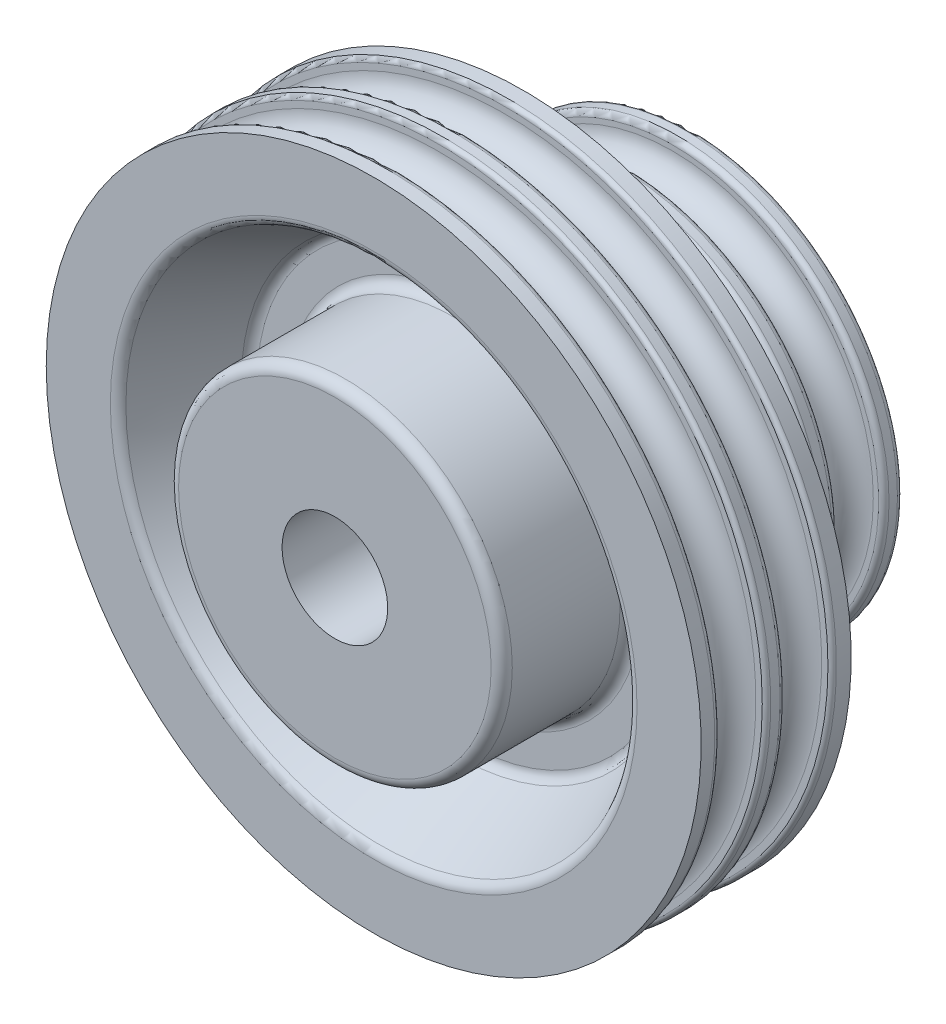
ISO-10303-21;
HEADER;
FILE_DESCRIPTION(('STEP AP214'),'2;1');
FILE_NAME('part.step','',(''),(''),'','','');
FILE_SCHEMA(('AUTOMOTIVE_DESIGN { 1 0 10303 214 1 1 1 1 }'));
ENDSEC;
DATA;
#1=APPLICATION_CONTEXT('core data for automotive mechanical design processes');
#2=APPLICATION_PROTOCOL_DEFINITION('international standard','automotive_design',2000,#1);
#3=PRODUCT_CONTEXT('',#1,'mechanical');
#4=PRODUCT('Part','Part','',(#3));
#5=PRODUCT_RELATED_PRODUCT_CATEGORY('part','',(#4));
#6=PRODUCT_DEFINITION_FORMATION('','',#4);
#7=PRODUCT_DEFINITION_CONTEXT('part definition',#1,'design');
#8=PRODUCT_DEFINITION('design','',#6,#7);
#9=PRODUCT_DEFINITION_SHAPE('','',#8);
#10=(LENGTH_UNIT() NAMED_UNIT(*) SI_UNIT(.MILLI.,.METRE.));
#11=(NAMED_UNIT(*) PLANE_ANGLE_UNIT() SI_UNIT($,.RADIAN.));
#12=(NAMED_UNIT(*) SI_UNIT($,.STERADIAN.) SOLID_ANGLE_UNIT());
#13=UNCERTAINTY_MEASURE_WITH_UNIT(LENGTH_MEASURE(1.E-05),#10,'distance_accuracy_value','');
#14=(GEOMETRIC_REPRESENTATION_CONTEXT(3) GLOBAL_UNCERTAINTY_ASSIGNED_CONTEXT((#13)) GLOBAL_UNIT_ASSIGNED_CONTEXT((#10,
#11,#12)) REPRESENTATION_CONTEXT('',''));
#15=CARTESIAN_POINT('',(0.,0.,0.));
#16=DIRECTION('',(0.,0.,1.));
#17=DIRECTION('',(1.,0.,0.));
#18=AXIS2_PLACEMENT_3D('',#15,#16,#17);
#19=CARTESIAN_POINT('',(-69.2512802675777,0.,1.65526286325597));
#20=DIRECTION('',(0.,0.,-1.));
#21=DIRECTION('',(-1.,0.,0.));
#22=AXIS2_PLACEMENT_3D('',#19,#20,#21);
#23=TOROIDAL_SURFACE('',#22,30.5000845419089,0.500000000000004);
#24=CARTESIAN_POINT('',(-69.2512802675777,0.,1.16534766525284));
#25=DIRECTION('',(0.,0.,-1.));
#26=DIRECTION('',(-1.,0.,0.));
#27=AXIS2_PLACEMENT_3D('',#24,#25,#26);
#28=CIRCLE('',#27,30.6);
#29=CARTESIAN_POINT('',(-99.8512802675777,0.,1.16534766525284));
#30=VERTEX_POINT('',#29);
#31=EDGE_CURVE('E10',#30,#30,#28,.T.);
#32=ORIENTED_EDGE('',*,*,#31,.F.);
#33=EDGE_LOOP('',(#32));
#34=FACE_BOUND('',#33,.T.);
#35=CARTESIAN_POINT('',(-69.2512802675777,0.,1.66445714199694));
#36=DIRECTION('',(0.,0.,-1.));
#37=DIRECTION('',(-1.,0.,0.));
#38=AXIS2_PLACEMENT_3D('',#35,#36,#37);
#39=CIRCLE('',#38,31.);
#40=CARTESIAN_POINT('',(-100.251280267578,0.,1.66445714199694));
#41=VERTEX_POINT('',#40);
#42=EDGE_CURVE('E151',#41,#41,#39,.T.);
#43=ORIENTED_EDGE('',*,*,#42,.T.);
#44=EDGE_LOOP('',(#43));
#45=FACE_BOUND('',#44,.T.);
#46=ADVANCED_FACE('F30',(#34,#45),#23,.T.);
#47=CARTESIAN_POINT('',(-39.2512802675777,0.,1.16534766525285));
#48=DIRECTION('',(0.,0.,1.));
#49=DIRECTION('',(1.,0.,0.));
#50=AXIS2_PLACEMENT_3D('',#47,#48,#49);
#51=PLANE('',#50);
#52=CARTESIAN_POINT('',(-69.2512802675777,0.,1.16534766525284));
#53=DIRECTION('',(0.,0.,-1.));
#54=DIRECTION('',(-1.,0.,0.));
#55=AXIS2_PLACEMENT_3D('',#52,#53,#54);
#56=CIRCLE('',#55,30.);
#57=CARTESIAN_POINT('',(-99.2512802675777,0.,1.16534766525284));
#58=VERTEX_POINT('',#57);
#59=EDGE_CURVE('E36',#58,#58,#56,.T.);
#60=ORIENTED_EDGE('',*,*,#59,.F.);
#61=EDGE_LOOP('',(#60));
#62=FACE_BOUND('',#61,.T.);
#63=ORIENTED_EDGE('',*,*,#31,.T.);
#64=EDGE_LOOP('',(#63));
#65=FACE_BOUND('',#64,.T.);
#66=ADVANCED_FACE('F339',(#62,#65),#51,.F.);
#67=CARTESIAN_POINT('',(-69.2512802675777,0.,-1.03465233474715));
#68=DIRECTION('',(0.,0.,-1.));
#69=DIRECTION('',(-1.,0.,0.));
#70=AXIS2_PLACEMENT_3D('',#67,#68,#69);
#71=TOROIDAL_SURFACE('',#70,30.,2.2);
#72=CARTESIAN_POINT('',(-69.2512802675777,0.,-3.23465233474715));
#73=DIRECTION('',(0.,0.,-1.));
#74=DIRECTION('',(-1.,0.,0.));
#75=AXIS2_PLACEMENT_3D('',#72,#73,#74);
#76=CIRCLE('',#75,30.);
#77=CARTESIAN_POINT('',(-99.2512802675777,0.,-3.23465233474716));
#78=VERTEX_POINT('',#77);
#79=EDGE_CURVE('E40',#78,#78,#76,.T.);
#80=ORIENTED_EDGE('',*,*,#79,.F.);
#81=EDGE_LOOP('',(#80));
#82=FACE_BOUND('',#81,.T.);
#83=ORIENTED_EDGE('',*,*,#59,.T.);
#84=EDGE_LOOP('',(#83));
#85=FACE_BOUND('',#84,.T.);
#86=ADVANCED_FACE('F334',(#82,#85),#71,.F.);
#87=CARTESIAN_POINT('',(-38.6512802675777,0.,-3.23465233474714));
#88=DIRECTION('',(0.,0.,-1.));
#89=DIRECTION('',(-1.,0.,0.));
#90=AXIS2_PLACEMENT_3D('',#87,#88,#89);
#91=PLANE('',#90);
#92=CARTESIAN_POINT('',(-69.2512802675777,0.,-3.23465233474715));
#93=DIRECTION('',(0.,0.,-1.));
#94=DIRECTION('',(-1.,0.,0.));
#95=AXIS2_PLACEMENT_3D('',#92,#93,#94);
#96=CIRCLE('',#95,30.6);
#97=CARTESIAN_POINT('',(-99.8512802675777,0.,-3.23465233474716));
#98=VERTEX_POINT('',#97);
#99=EDGE_CURVE('E44',#98,#98,#96,.T.);
#100=ORIENTED_EDGE('',*,*,#99,.F.);
#101=EDGE_LOOP('',(#100));
#102=FACE_BOUND('',#101,.T.);
#103=ORIENTED_EDGE('',*,*,#79,.T.);
#104=EDGE_LOOP('',(#103));
#105=FACE_BOUND('',#104,.T.);
#106=ADVANCED_FACE('F328',(#102,#105),#91,.F.);
#107=CARTESIAN_POINT('',(-69.2512802675777,0.,-3.63465233474713));
#108=DIRECTION('',(0.,0.,-1.));
#109=DIRECTION('',(-1.,0.,0.));
#110=AXIS2_PLACEMENT_3D('',#107,#108,#109);
#111=TOROIDAL_SURFACE('',#110,30.6,0.399999999999977);
#112=CARTESIAN_POINT('',(-69.2512802675777,0.,-3.63465233474713));
#113=DIRECTION('',(0.,0.,-1.));
#114=DIRECTION('',(-1.,0.,0.));
#115=AXIS2_PLACEMENT_3D('',#112,#113,#114);
#116=CIRCLE('',#115,31.);
#117=CARTESIAN_POINT('',(-100.251280267578,0.,-3.63465233474713));
#118=VERTEX_POINT('',#117);
#119=EDGE_CURVE('E49',#118,#118,#116,.T.);
#120=ORIENTED_EDGE('',*,*,#119,.F.);
#121=EDGE_LOOP('',(#120));
#122=FACE_BOUND('',#121,.T.);
#123=ORIENTED_EDGE('',*,*,#99,.T.);
#124=EDGE_LOOP('',(#123));
#125=FACE_BOUND('',#124,.T.);
#126=ADVANCED_FACE('F322',(#122,#125),#111,.T.);
#127=CARTESIAN_POINT('',(-69.2512802675777,0.,-55.2783424319312));
#128=DIRECTION('',(0.,0.,-1.));
#129=DIRECTION('',(-1.,0.,0.));
#130=AXIS2_PLACEMENT_3D('',#127,#128,#129);
#131=CYLINDRICAL_SURFACE('',#130,31.);
#132=CARTESIAN_POINT('',(-69.2512802675777,0.,-4.5161790880647));
#133=DIRECTION('',(0.,0.,-1.));
#134=DIRECTION('',(-1.,0.,0.));
#135=AXIS2_PLACEMENT_3D('',#132,#133,#134);
#136=CIRCLE('',#135,31.);
#137=CARTESIAN_POINT('',(-100.251280267578,0.,-4.5161790880647));
#138=VERTEX_POINT('',#137);
#139=EDGE_CURVE('E52',#138,#138,#136,.T.);
#140=ORIENTED_EDGE('',*,*,#139,.F.);
#141=EDGE_LOOP('',(#140));
#142=FACE_BOUND('',#141,.T.);
#143=ORIENTED_EDGE('',*,*,#119,.T.);
#144=EDGE_LOOP('',(#143));
#145=FACE_BOUND('',#144,.T.);
#146=ADVANCED_FACE('F316',(#142,#145),#131,.T.);
#147=CARTESIAN_POINT('',(-69.2512802675777,0.,-4.5161790880647));
#148=DIRECTION('',(0.,0.,-1.));
#149=DIRECTION('',(-1.,0.,0.));
#150=AXIS2_PLACEMENT_3D('',#147,#148,#149);
#151=TOROIDAL_SURFACE('',#150,30.5,0.5);
#152=CARTESIAN_POINT('',(-69.2512802675777,0.,-5.0161790880647));
#153=DIRECTION('',(0.,0.,-1.));
#154=DIRECTION('',(-1.,0.,0.));
#155=AXIS2_PLACEMENT_3D('',#152,#153,#154);
#156=CIRCLE('',#155,30.5);
#157=CARTESIAN_POINT('',(-99.7512802675777,0.,-5.0161790880647));
#158=VERTEX_POINT('',#157);
#159=EDGE_CURVE('E55',#158,#158,#156,.T.);
#160=ORIENTED_EDGE('',*,*,#159,.F.);
#161=EDGE_LOOP('',(#160));
#162=FACE_BOUND('',#161,.T.);
#163=ORIENTED_EDGE('',*,*,#139,.T.);
#164=EDGE_LOOP('',(#163));
#165=FACE_BOUND('',#164,.T.);
#166=ADVANCED_FACE('F310',(#162,#165),#151,.T.);
#167=CARTESIAN_POINT('',(-39.2512802675777,0.,-5.01617908806469));
#168=DIRECTION('',(0.,0.,1.));
#169=DIRECTION('',(1.,0.,0.));
#170=AXIS2_PLACEMENT_3D('',#167,#168,#169);
#171=PLANE('',#170);
#172=CARTESIAN_POINT('',(-69.2512802675777,0.,-5.0161790880647));
#173=DIRECTION('',(0.,0.,-1.));
#174=DIRECTION('',(-1.,0.,0.));
#175=AXIS2_PLACEMENT_3D('',#172,#173,#174);
#176=CIRCLE('',#175,30.);
#177=CARTESIAN_POINT('',(-99.2512802675777,0.,-5.0161790880647));
#178=VERTEX_POINT('',#177);
#179=EDGE_CURVE('E58',#178,#178,#176,.T.);
#180=ORIENTED_EDGE('',*,*,#179,.F.);
#181=EDGE_LOOP('',(#180));
#182=FACE_BOUND('',#181,.T.);
#183=ORIENTED_EDGE('',*,*,#159,.T.);
#184=EDGE_LOOP('',(#183));
#185=FACE_BOUND('',#184,.T.);
#186=ADVANCED_FACE('F304',(#182,#185),#171,.F.);
#187=CARTESIAN_POINT('',(-69.2512802675777,0.,-7.23465233474715));
#188=DIRECTION('',(0.,0.,-1.));
#189=DIRECTION('',(-1.,0.,0.));
#190=AXIS2_PLACEMENT_3D('',#187,#188,#189);
#191=TOROIDAL_SURFACE('',#190,30.,2.21847324668245);
#192=CARTESIAN_POINT('',(-69.2512802675777,0.,-9.4531255814296));
#193=DIRECTION('',(0.,0.,-1.));
#194=DIRECTION('',(-1.,0.,0.));
#195=AXIS2_PLACEMENT_3D('',#192,#193,#194);
#196=CIRCLE('',#195,30.);
#197=CARTESIAN_POINT('',(-99.2512802675777,0.,-9.45312558142961));
#198=VERTEX_POINT('',#197);
#199=EDGE_CURVE('E61',#198,#198,#196,.T.);
#200=ORIENTED_EDGE('',*,*,#199,.F.);
#201=EDGE_LOOP('',(#200));
#202=FACE_BOUND('',#201,.T.);
#203=ORIENTED_EDGE('',*,*,#179,.T.);
#204=EDGE_LOOP('',(#203));
#205=FACE_BOUND('',#204,.T.);
#206=ADVANCED_FACE('F298',(#202,#205),#191,.F.);
#207=CARTESIAN_POINT('',(-38.6512802675777,0.,-9.4531255814296));
#208=DIRECTION('',(0.,0.,-1.));
#209=DIRECTION('',(-1.,0.,0.));
#210=AXIS2_PLACEMENT_3D('',#207,#208,#209);
#211=PLANE('',#210);
#212=CARTESIAN_POINT('',(-69.2512802675777,0.,-9.4531255814296));
#213=DIRECTION('',(0.,0.,-1.));
#214=DIRECTION('',(-1.,0.,0.));
#215=AXIS2_PLACEMENT_3D('',#212,#213,#214);
#216=CIRCLE('',#215,30.6);
#217=CARTESIAN_POINT('',(-99.8512802675777,0.,-9.45312558142961));
#218=VERTEX_POINT('',#217);
#219=EDGE_CURVE('E64',#218,#218,#216,.T.);
#220=ORIENTED_EDGE('',*,*,#219,.F.);
#221=EDGE_LOOP('',(#220));
#222=FACE_BOUND('',#221,.T.);
#223=ORIENTED_EDGE('',*,*,#199,.T.);
#224=EDGE_LOOP('',(#223));
#225=FACE_BOUND('',#224,.T.);
#226=ADVANCED_FACE('F292',(#222,#225),#211,.F.);
#227=CARTESIAN_POINT('',(-69.2512802675777,0.,-9.85312558142958));
#228=DIRECTION('',(0.,0.,-1.));
#229=DIRECTION('',(-1.,0.,0.));
#230=AXIS2_PLACEMENT_3D('',#227,#228,#229);
#231=TOROIDAL_SURFACE('',#230,30.6,0.399999999999977);
#232=CARTESIAN_POINT('',(-69.2512802675777,0.,-9.85312558142958));
#233=DIRECTION('',(0.,0.,-1.));
#234=DIRECTION('',(-1.,0.,0.));
#235=AXIS2_PLACEMENT_3D('',#232,#233,#234);
#236=CIRCLE('',#235,31.);
#237=CARTESIAN_POINT('',(-100.251280267578,0.,-9.85312558142959));
#238=VERTEX_POINT('',#237);
#239=EDGE_CURVE('E67',#238,#238,#236,.T.);
#240=ORIENTED_EDGE('',*,*,#239,.F.);
#241=EDGE_LOOP('',(#240));
#242=FACE_BOUND('',#241,.T.);
#243=ORIENTED_EDGE('',*,*,#219,.T.);
#244=EDGE_LOOP('',(#243));
#245=FACE_BOUND('',#244,.T.);
#246=ADVANCED_FACE('F286',(#242,#245),#231,.T.);
#247=CARTESIAN_POINT('',(-69.2512802675777,0.,-55.2783424319312));
#248=DIRECTION('',(0.,0.,-1.));
#249=DIRECTION('',(-1.,0.,0.));
#250=AXIS2_PLACEMENT_3D('',#247,#248,#249);
#251=CYLINDRICAL_SURFACE('',#250,31.);
#252=CARTESIAN_POINT('',(-69.2512802675777,0.,-11.2531255814296));
#253=DIRECTION('',(0.,0.,-1.));
#254=DIRECTION('',(-1.,0.,0.));
#255=AXIS2_PLACEMENT_3D('',#252,#253,#254);
#256=CIRCLE('',#255,31.);
#257=CARTESIAN_POINT('',(-100.251280267578,0.,-11.2531255814296));
#258=VERTEX_POINT('',#257);
#259=EDGE_CURVE('E70',#258,#258,#256,.T.);
#260=ORIENTED_EDGE('',*,*,#259,.F.);
#261=EDGE_LOOP('',(#260));
#262=FACE_BOUND('',#261,.T.);
#263=ORIENTED_EDGE('',*,*,#239,.T.);
#264=EDGE_LOOP('',(#263));
#265=FACE_BOUND('',#264,.T.);
#266=ADVANCED_FACE('F280',(#262,#265),#251,.T.);
#267=CARTESIAN_POINT('',(-48.7512802675777,0.,-11.2531255814296));
#268=DIRECTION('',(0.,0.,1.));
#269=DIRECTION('',(1.,0.,0.));
#270=AXIS2_PLACEMENT_3D('',#267,#268,#269);
#271=PLANE('',#270);
#272=CARTESIAN_POINT('',(-69.2512802675777,0.,-11.2531255814296));
#273=DIRECTION('',(0.,0.,-1.));
#274=DIRECTION('',(-1.,0.,0.));
#275=AXIS2_PLACEMENT_3D('',#272,#273,#274);
#276=CIRCLE('',#275,20.5);
#277=CARTESIAN_POINT('',(-89.7512802675777,0.,-11.2531255814296));
#278=VERTEX_POINT('',#277);
#279=EDGE_CURVE('E73',#278,#278,#276,.T.);
#280=ORIENTED_EDGE('',*,*,#279,.F.);
#281=EDGE_LOOP('',(#280));
#282=FACE_BOUND('',#281,.T.);
#283=ORIENTED_EDGE('',*,*,#259,.T.);
#284=EDGE_LOOP('',(#283));
#285=FACE_BOUND('',#284,.T.);
#286=ADVANCED_FACE('F274',(#282,#285),#271,.F.);
#287=CARTESIAN_POINT('',(-69.2512802675777,0.,-11.7531255814296));
#288=DIRECTION('',(0.,0.,-1.));
#289=DIRECTION('',(-1.,0.,0.));
#290=AXIS2_PLACEMENT_3D('',#287,#288,#289);
#291=TOROIDAL_SURFACE('',#290,20.5,0.5);
#292=CARTESIAN_POINT('',(-69.2512802675777,0.,-11.7531255814296));
#293=DIRECTION('',(0.,0.,-1.));
#294=DIRECTION('',(-1.,0.,0.));
#295=AXIS2_PLACEMENT_3D('',#292,#293,#294);
#296=CIRCLE('',#295,20.);
#297=CARTESIAN_POINT('',(-89.2512802675777,0.,-11.7531255814296));
#298=VERTEX_POINT('',#297);
#299=EDGE_CURVE('E76',#298,#298,#296,.T.);
#300=ORIENTED_EDGE('',*,*,#299,.F.);
#301=EDGE_LOOP('',(#300));
#302=FACE_BOUND('',#301,.T.);
#303=ORIENTED_EDGE('',*,*,#279,.T.);
#304=EDGE_LOOP('',(#303));
#305=FACE_BOUND('',#304,.T.);
#306=ADVANCED_FACE('F268',(#302,#305),#291,.F.);
#307=CARTESIAN_POINT('',(-69.2512802675777,0.,-55.2783424319312));
#308=DIRECTION('',(0.,0.,-1.));
#309=DIRECTION('',(-1.,0.,0.));
#310=AXIS2_PLACEMENT_3D('',#307,#308,#309);
#311=CYLINDRICAL_SURFACE('',#310,20.);
#312=CARTESIAN_POINT('',(-69.2512802675777,0.,-14.2531255814296));
#313=DIRECTION('',(0.,0.,-1.));
#314=DIRECTION('',(-1.,0.,0.));
#315=AXIS2_PLACEMENT_3D('',#312,#313,#314);
#316=CIRCLE('',#315,20.);
#317=CARTESIAN_POINT('',(-89.2512802675777,0.,-14.2531255814296));
#318=VERTEX_POINT('',#317);
#319=EDGE_CURVE('E79',#318,#318,#316,.T.);
#320=ORIENTED_EDGE('',*,*,#319,.F.);
#321=EDGE_LOOP('',(#320));
#322=FACE_BOUND('',#321,.T.);
#323=ORIENTED_EDGE('',*,*,#299,.T.);
#324=EDGE_LOOP('',(#323));
#325=FACE_BOUND('',#324,.T.);
#326=ADVANCED_FACE('F262',(#322,#325),#311,.T.);
#327=CARTESIAN_POINT('',(-69.2512802675777,0.,-14.2531255814296));
#328=DIRECTION('',(0.,0.,-1.));
#329=DIRECTION('',(-1.,0.,0.));
#330=AXIS2_PLACEMENT_3D('',#327,#328,#329);
#331=TOROIDAL_SURFACE('',#330,19.5,0.5);
#332=CARTESIAN_POINT('',(-69.2512802675777,0.,-14.7531255814296));
#333=DIRECTION('',(0.,0.,-1.));
#334=DIRECTION('',(-1.,0.,0.));
#335=AXIS2_PLACEMENT_3D('',#332,#333,#334);
#336=CIRCLE('',#335,19.5);
#337=CARTESIAN_POINT('',(-88.7512802675777,0.,-14.7531255814296));
#338=VERTEX_POINT('',#337);
#339=EDGE_CURVE('E82',#338,#338,#336,.T.);
#340=ORIENTED_EDGE('',*,*,#339,.F.);
#341=EDGE_LOOP('',(#340));
#342=FACE_BOUND('',#341,.T.);
#343=ORIENTED_EDGE('',*,*,#319,.T.);
#344=EDGE_LOOP('',(#343));
#345=FACE_BOUND('',#344,.T.);
#346=ADVANCED_FACE('F256',(#342,#345),#331,.T.);
#347=CARTESIAN_POINT('',(-50.5903012459588,0.,-14.7531255814296));
#348=DIRECTION('',(0.,0.,1.));
#349=DIRECTION('',(1.,0.,0.));
#350=AXIS2_PLACEMENT_3D('',#347,#348,#349);
#351=PLANE('',#350);
#352=CARTESIAN_POINT('',(-69.2512802675777,0.,-14.7531255814296));
#353=DIRECTION('',(0.,0.,-1.));
#354=DIRECTION('',(-1.,0.,0.));
#355=AXIS2_PLACEMENT_3D('',#352,#353,#354);
#356=CIRCLE('',#355,18.660979021619);
#357=CARTESIAN_POINT('',(-87.9122592891967,0.,-14.7531255814296));
#358=VERTEX_POINT('',#357);
#359=EDGE_CURVE('E85',#358,#358,#356,.T.);
#360=ORIENTED_EDGE('',*,*,#359,.F.);
#361=EDGE_LOOP('',(#360));
#362=FACE_BOUND('',#361,.T.);
#363=ORIENTED_EDGE('',*,*,#339,.T.);
#364=EDGE_LOOP('',(#363));
#365=FACE_BOUND('',#364,.T.);
#366=ADVANCED_FACE('F250',(#362,#365),#351,.F.);
#367=CARTESIAN_POINT('',(-69.2512802675777,0.,-16.9494206839804));
#368=DIRECTION('',(0.,0.,-1.));
#369=DIRECTION('',(-1.,0.,0.));
#370=AXIS2_PLACEMENT_3D('',#367,#368,#369);
#371=TOROIDAL_SURFACE('',#370,18.788602775331,2.2);
#372=CARTESIAN_POINT('',(-69.2512802675777,0.,-19.1457157865311));
#373=DIRECTION('',(0.,0.,-1.));
#374=DIRECTION('',(-1.,0.,0.));
#375=AXIS2_PLACEMENT_3D('',#372,#373,#374);
#376=CIRCLE('',#375,18.9162265290429);
#377=CARTESIAN_POINT('',(-88.1675067966207,0.,-19.1457157865311));
#378=VERTEX_POINT('',#377);
#379=EDGE_CURVE('E88',#378,#378,#376,.T.);
#380=ORIENTED_EDGE('',*,*,#379,.F.);
#381=EDGE_LOOP('',(#380));
#382=FACE_BOUND('',#381,.T.);
#383=ORIENTED_EDGE('',*,*,#359,.T.);
#384=EDGE_LOOP('',(#383));
#385=FACE_BOUND('',#384,.T.);
#386=ADVANCED_FACE('F244',(#382,#385),#371,.F.);
#387=CARTESIAN_POINT('',(-50.3350537385348,0.,-19.1457157865311));
#388=DIRECTION('',(0.,0.,-1.));
#389=DIRECTION('',(-1.,0.,0.));
#390=AXIS2_PLACEMENT_3D('',#387,#388,#389);
#391=PLANE('',#390);
#392=CARTESIAN_POINT('',(-69.2512802675777,0.,-19.1457157865311));
#393=DIRECTION('',(0.,0.,-1.));
#394=DIRECTION('',(-1.,0.,0.));
#395=AXIS2_PLACEMENT_3D('',#392,#393,#394);
#396=CIRCLE('',#395,19.5);
#397=CARTESIAN_POINT('',(-88.7512802675777,0.,-19.1457157865311));
#398=VERTEX_POINT('',#397);
#399=EDGE_CURVE('E91',#398,#398,#396,.T.);
#400=ORIENTED_EDGE('',*,*,#399,.F.);
#401=EDGE_LOOP('',(#400));
#402=FACE_BOUND('',#401,.T.);
#403=ORIENTED_EDGE('',*,*,#379,.T.);
#404=EDGE_LOOP('',(#403));
#405=FACE_BOUND('',#404,.T.);
#406=ADVANCED_FACE('F238',(#402,#405),#391,.F.);
#407=CARTESIAN_POINT('',(-69.2512802675777,0.,-19.6457157865311));
#408=DIRECTION('',(0.,0.,-1.));
#409=DIRECTION('',(-1.,0.,0.));
#410=AXIS2_PLACEMENT_3D('',#407,#408,#409);
#411=TOROIDAL_SURFACE('',#410,19.5,0.499999999999999);
#412=CARTESIAN_POINT('',(-69.2512802675777,0.,-19.6457157865311));
#413=DIRECTION('',(0.,0.,-1.));
#414=DIRECTION('',(-1.,0.,0.));
#415=AXIS2_PLACEMENT_3D('',#412,#413,#414);
#416=CIRCLE('',#415,20.);
#417=CARTESIAN_POINT('',(-89.2512802675777,0.,-19.6457157865311));
#418=VERTEX_POINT('',#417);
#419=EDGE_CURVE('E94',#418,#418,#416,.T.);
#420=ORIENTED_EDGE('',*,*,#419,.F.);
#421=EDGE_LOOP('',(#420));
#422=FACE_BOUND('',#421,.T.);
#423=ORIENTED_EDGE('',*,*,#399,.T.);
#424=EDGE_LOOP('',(#423));
#425=FACE_BOUND('',#424,.T.);
#426=ADVANCED_FACE('F232',(#422,#425),#411,.T.);
#427=CARTESIAN_POINT('',(-69.2512802675777,0.,-55.2783424319312));
#428=DIRECTION('',(0.,0.,-1.));
#429=DIRECTION('',(-1.,0.,0.));
#430=AXIS2_PLACEMENT_3D('',#427,#428,#429);
#431=CYLINDRICAL_SURFACE('',#430,20.);
#432=CARTESIAN_POINT('',(-69.2512802675777,0.,-20.4437652868408));
#433=DIRECTION('',(0.,0.,-1.));
#434=DIRECTION('',(-1.,0.,0.));
#435=AXIS2_PLACEMENT_3D('',#432,#433,#434);
#436=CIRCLE('',#435,20.);
#437=CARTESIAN_POINT('',(-89.2512802675777,0.,-20.4437652868408));
#438=VERTEX_POINT('',#437);
#439=EDGE_CURVE('E97',#438,#438,#436,.T.);
#440=ORIENTED_EDGE('',*,*,#439,.F.);
#441=EDGE_LOOP('',(#440));
#442=FACE_BOUND('',#441,.T.);
#443=ORIENTED_EDGE('',*,*,#419,.T.);
#444=EDGE_LOOP('',(#443));
#445=FACE_BOUND('',#444,.T.);
#446=ADVANCED_FACE('F226',(#442,#445),#431,.T.);
#447=CARTESIAN_POINT('',(-69.2512802675777,0.,-20.4437652868408));
#448=DIRECTION('',(0.,0.,-1.));
#449=DIRECTION('',(-1.,0.,0.));
#450=AXIS2_PLACEMENT_3D('',#447,#448,#449);
#451=TOROIDAL_SURFACE('',#450,19.5,0.500000000000004);
#452=CARTESIAN_POINT('',(-69.2512802675777,0.,-20.9437652868408));
#453=DIRECTION('',(0.,0.,-1.));
#454=DIRECTION('',(-1.,0.,0.));
#455=AXIS2_PLACEMENT_3D('',#452,#453,#454);
#456=CIRCLE('',#455,19.5);
#457=CARTESIAN_POINT('',(-88.7512802675777,0.,-20.9437652868408));
#458=VERTEX_POINT('',#457);
#459=EDGE_CURVE('E100',#458,#458,#456,.T.);
#460=ORIENTED_EDGE('',*,*,#459,.F.);
#461=EDGE_LOOP('',(#460));
#462=FACE_BOUND('',#461,.T.);
#463=ORIENTED_EDGE('',*,*,#439,.T.);
#464=EDGE_LOOP('',(#463));
#465=FACE_BOUND('',#464,.T.);
#466=ADVANCED_FACE('F220',(#462,#465),#451,.T.);
#467=CARTESIAN_POINT('',(-50.2512802675777,0.,-20.9437652868408));
#468=DIRECTION('',(0.,0.,1.));
#469=DIRECTION('',(1.,0.,0.));
#470=AXIS2_PLACEMENT_3D('',#467,#468,#469);
#471=PLANE('',#470);
#472=CARTESIAN_POINT('',(-69.2512802675777,0.,-20.9437652868408));
#473=DIRECTION('',(0.,0.,-1.));
#474=DIRECTION('',(-1.,0.,0.));
#475=AXIS2_PLACEMENT_3D('',#472,#473,#474);
#476=CIRCLE('',#475,19.);
#477=CARTESIAN_POINT('',(-88.2512802675777,0.,-20.9437652868408));
#478=VERTEX_POINT('',#477);
#479=EDGE_CURVE('E103',#478,#478,#476,.T.);
#480=ORIENTED_EDGE('',*,*,#479,.F.);
#481=EDGE_LOOP('',(#480));
#482=FACE_BOUND('',#481,.T.);
#483=ORIENTED_EDGE('',*,*,#459,.T.);
#484=EDGE_LOOP('',(#483));
#485=FACE_BOUND('',#484,.T.);
#486=ADVANCED_FACE('F214',(#482,#485),#471,.F.);
#487=CARTESIAN_POINT('',(-69.2512802675777,0.,-23.1437652868408));
#488=DIRECTION('',(0.,0.,-1.));
#489=DIRECTION('',(-1.,0.,0.));
#490=AXIS2_PLACEMENT_3D('',#487,#488,#489);
#491=TOROIDAL_SURFACE('',#490,19.,2.2);
#492=CARTESIAN_POINT('',(-69.2512802675777,0.,-25.3437652868408));
#493=DIRECTION('',(0.,0.,-1.));
#494=DIRECTION('',(-1.,0.,0.));
#495=AXIS2_PLACEMENT_3D('',#492,#493,#494);
#496=CIRCLE('',#495,19.);
#497=CARTESIAN_POINT('',(-88.2512802675777,0.,-25.3437652868408));
#498=VERTEX_POINT('',#497);
#499=EDGE_CURVE('E106',#498,#498,#496,.T.);
#500=ORIENTED_EDGE('',*,*,#499,.F.);
#501=EDGE_LOOP('',(#500));
#502=FACE_BOUND('',#501,.T.);
#503=ORIENTED_EDGE('',*,*,#479,.T.);
#504=EDGE_LOOP('',(#503));
#505=FACE_BOUND('',#504,.T.);
#506=ADVANCED_FACE('F208',(#502,#505),#491,.F.);
#507=CARTESIAN_POINT('',(-49.7512166417142,0.,-25.3437652868408));
#508=DIRECTION('',(0.,0.,-1.));
#509=DIRECTION('',(-1.,0.,0.));
#510=AXIS2_PLACEMENT_3D('',#507,#508,#509);
#511=PLANE('',#510);
#512=CARTESIAN_POINT('',(-69.2512802675777,0.,-25.3437652868408));
#513=DIRECTION('',(0.,0.,-1.));
#514=DIRECTION('',(-1.,0.,0.));
#515=AXIS2_PLACEMENT_3D('',#512,#513,#514);
#516=CIRCLE('',#515,19.5000636258635);
#517=CARTESIAN_POINT('',(-88.7513438934412,0.,-25.3437652868408));
#518=VERTEX_POINT('',#517);
#519=EDGE_CURVE('E109',#518,#518,#516,.T.);
#520=ORIENTED_EDGE('',*,*,#519,.F.);
#521=EDGE_LOOP('',(#520));
#522=FACE_BOUND('',#521,.T.);
#523=ORIENTED_EDGE('',*,*,#499,.T.);
#524=EDGE_LOOP('',(#523));
#525=FACE_BOUND('',#524,.T.);
#526=ADVANCED_FACE('F202',(#522,#525),#511,.F.);
#527=CARTESIAN_POINT('',(-69.2512802675777,0.,-25.8437652868408));
#528=DIRECTION('',(0.,0.,-1.));
#529=DIRECTION('',(-1.,0.,0.));
#530=AXIS2_PLACEMENT_3D('',#527,#528,#529);
#531=TOROIDAL_SURFACE('',#530,19.5000636258635,0.499999999999999);
#532=CARTESIAN_POINT('',(-69.2512802675777,0.,-25.835788958408));
#533=DIRECTION('',(0.,0.,-1.));
#534=DIRECTION('',(-1.,0.,0.));
#535=AXIS2_PLACEMENT_3D('',#532,#533,#534);
#536=CIRCLE('',#535,20.);
#537=CARTESIAN_POINT('',(-89.2512802675777,0.,-25.835788958408));
#538=VERTEX_POINT('',#537);
#539=EDGE_CURVE('E112',#538,#538,#536,.T.);
#540=ORIENTED_EDGE('',*,*,#539,.F.);
#541=EDGE_LOOP('',(#540));
#542=FACE_BOUND('',#541,.T.);
#543=ORIENTED_EDGE('',*,*,#519,.T.);
#544=EDGE_LOOP('',(#543));
#545=FACE_BOUND('',#544,.T.);
#546=ADVANCED_FACE('F196',(#542,#545),#531,.T.);
#547=CARTESIAN_POINT('',(-69.2512802675777,0.,-55.2783424319312));
#548=DIRECTION('',(0.,0.,-1.));
#549=DIRECTION('',(-1.,0.,0.));
#550=AXIS2_PLACEMENT_3D('',#547,#548,#549);
#551=CYLINDRICAL_SURFACE('',#550,20.);
#552=CARTESIAN_POINT('',(-69.2512802675777,0.,-26.635542858003));
#553=DIRECTION('',(0.,0.,-1.));
#554=DIRECTION('',(-1.,0.,0.));
#555=AXIS2_PLACEMENT_3D('',#552,#553,#554);
#556=CIRCLE('',#555,20.);
#557=CARTESIAN_POINT('',(-89.2512802675777,0.,-26.6355428580031));
#558=VERTEX_POINT('',#557);
#559=EDGE_CURVE('E115',#558,#558,#556,.T.);
#560=ORIENTED_EDGE('',*,*,#559,.F.);
#561=EDGE_LOOP('',(#560));
#562=FACE_BOUND('',#561,.T.);
#563=ORIENTED_EDGE('',*,*,#539,.T.);
#564=EDGE_LOOP('',(#563));
#565=FACE_BOUND('',#564,.T.);
#566=ADVANCED_FACE('F190',(#562,#565),#551,.T.);
#567=CARTESIAN_POINT('',(-69.2512802675777,0.,-26.6437652870685));
#568=DIRECTION('',(0.,0.,-1.));
#569=DIRECTION('',(-1.,0.,0.));
#570=AXIS2_PLACEMENT_3D('',#567,#568,#569);
#571=TOROIDAL_SURFACE('',#570,19.5000676129112,0.5);
#572=CARTESIAN_POINT('',(-69.2512802675777,0.,-27.1437652868408));
#573=DIRECTION('',(0.,0.,-1.));
#574=DIRECTION('',(-1.,0.,0.));
#575=AXIS2_PLACEMENT_3D('',#572,#573,#574);
#576=CIRCLE('',#575,19.500082702283);
#577=CARTESIAN_POINT('',(-88.7513629698607,0.,-27.1437652868408));
#578=VERTEX_POINT('',#577);
#579=EDGE_CURVE('E118',#578,#578,#576,.T.);
#580=ORIENTED_EDGE('',*,*,#579,.F.);
#581=EDGE_LOOP('',(#580));
#582=FACE_BOUND('',#581,.T.);
#583=ORIENTED_EDGE('',*,*,#559,.T.);
#584=EDGE_LOOP('',(#583));
#585=FACE_BOUND('',#584,.T.);
#586=ADVANCED_FACE('F184',(#582,#585),#571,.T.);
#587=CARTESIAN_POINT('',(-49.7511975652947,0.,-27.1437652868408));
#588=DIRECTION('',(0.,0.,1.));
#589=DIRECTION('',(1.,0.,0.));
#590=AXIS2_PLACEMENT_3D('',#587,#588,#589);
#591=PLANE('',#590);
#592=CARTESIAN_POINT('',(-69.2512802675777,0.,-27.1437652868408));
#593=DIRECTION('',(0.,0.,-1.));
#594=DIRECTION('',(-1.,0.,0.));
#595=AXIS2_PLACEMENT_3D('',#592,#593,#594);
#596=CIRCLE('',#595,11.);
#597=CARTESIAN_POINT('',(-80.2512802675777,0.,-27.1437652868408));
#598=VERTEX_POINT('',#597);
#599=EDGE_CURVE('E121',#598,#598,#596,.T.);
#600=ORIENTED_EDGE('',*,*,#599,.F.);
#601=EDGE_LOOP('',(#600));
#602=FACE_BOUND('',#601,.T.);
#603=ORIENTED_EDGE('',*,*,#579,.T.);
#604=EDGE_LOOP('',(#603));
#605=FACE_BOUND('',#604,.T.);
#606=ADVANCED_FACE('F180',(#602,#605),#591,.F.);
#607=CARTESIAN_POINT('',(-54.4551284451478,0.,6.62532639375862));
#608=DIRECTION('',(0.,0.,-1.));
#609=DIRECTION('',(-1.,0.,0.));
#610=AXIS2_PLACEMENT_3D('',#607,#608,#609);
#611=PLANE('',#610);
#612=CARTESIAN_POINT('',(-69.2512802675777,0.,6.62532639375862));
#613=DIRECTION('',(0.,0.,-1.));
#614=DIRECTION('',(-1.,0.,0.));
#615=AXIS2_PLACEMENT_3D('',#612,#613,#614);
#616=CIRCLE('',#615,5.);
#617=CARTESIAN_POINT('',(-74.2512802675777,0.,6.62532639375862));
#618=VERTEX_POINT('',#617);
#619=EDGE_CURVE('E157',#618,#618,#616,.T.);
#620=ORIENTED_EDGE('',*,*,#619,.T.);
#621=EDGE_LOOP('',(#620));
#622=FACE_BOUND('',#621,.T.);
#623=CARTESIAN_POINT('',(-69.2512802675777,0.,6.62532639375862));
#624=DIRECTION('',(0.,0.,-1.));
#625=DIRECTION('',(-1.,0.,0.));
#626=AXIS2_PLACEMENT_3D('',#623,#624,#625);
#627=CIRCLE('',#626,14.7961518224299);
#628=CARTESIAN_POINT('',(-84.0474320900077,0.,6.62532639375862));
#629=VERTEX_POINT('',#628);
#630=EDGE_CURVE('E124',#629,#629,#627,.T.);
#631=ORIENTED_EDGE('',*,*,#630,.F.);
#632=EDGE_LOOP('',(#631));
#633=FACE_BOUND('',#632,.T.);
#634=ADVANCED_FACE('F183',(#622,#633),#611,.F.);
#635=CARTESIAN_POINT('',(-69.2512802675777,0.,5.62532639375863));
#636=DIRECTION('',(0.,0.,-1.));
#637=DIRECTION('',(-1.,0.,0.));
#638=AXIS2_PLACEMENT_3D('',#635,#636,#637);
#639=TOROIDAL_SURFACE('',#638,14.7961518224299,0.999999999999994);
#640=CARTESIAN_POINT('',(-69.2512802675777,0.,5.62532639375863));
#641=DIRECTION('',(0.,0.,-1.));
#642=DIRECTION('',(-1.,0.,0.));
#643=AXIS2_PLACEMENT_3D('',#640,#641,#642);
#644=CIRCLE('',#643,15.7961518224299);
#645=CARTESIAN_POINT('',(-85.0474320900077,0.,5.62532639375863));
#646=VERTEX_POINT('',#645);
#647=EDGE_CURVE('E127',#646,#646,#644,.T.);
#648=ORIENTED_EDGE('',*,*,#647,.F.);
#649=EDGE_LOOP('',(#648));
#650=FACE_BOUND('',#649,.T.);
#651=ORIENTED_EDGE('',*,*,#630,.T.);
#652=EDGE_LOOP('',(#651));
#653=FACE_BOUND('',#652,.T.);
#654=ADVANCED_FACE('F396',(#650,#653),#639,.T.);
#655=CARTESIAN_POINT('',(-69.2512802675777,0.,-55.2783424319312));
#656=DIRECTION('',(0.,0.,-1.));
#657=DIRECTION('',(-1.,0.,0.));
#658=AXIS2_PLACEMENT_3D('',#655,#656,#657);
#659=CYLINDRICAL_SURFACE('',#658,15.7961518224299);
#660=CARTESIAN_POINT('',(-69.2512802675777,0.,-4.58027240806085));
#661=DIRECTION('',(0.,0.,-1.));
#662=DIRECTION('',(-1.,0.,0.));
#663=AXIS2_PLACEMENT_3D('',#660,#661,#662);
#664=CIRCLE('',#663,15.7961518224299);
#665=CARTESIAN_POINT('',(-85.0474320900077,0.,-4.58027240806085));
#666=VERTEX_POINT('',#665);
#667=EDGE_CURVE('E130',#666,#666,#664,.T.);
#668=ORIENTED_EDGE('',*,*,#667,.F.);
#669=EDGE_LOOP('',(#668));
#670=FACE_BOUND('',#669,.T.);
#671=ORIENTED_EDGE('',*,*,#647,.T.);
#672=EDGE_LOOP('',(#671));
#673=FACE_BOUND('',#672,.T.);
#674=ADVANCED_FACE('F390',(#670,#673),#659,.T.);
#675=CARTESIAN_POINT('',(-69.2512802675777,0.,-4.58027240806085));
#676=DIRECTION('',(0.,0.,-1.));
#677=DIRECTION('',(-1.,0.,0.));
#678=AXIS2_PLACEMENT_3D('',#675,#676,#677);
#679=TOROIDAL_SURFACE('',#678,16.7961518224299,1.);
#680=CARTESIAN_POINT('',(-69.2512802675777,0.,-5.58027240806085));
#681=DIRECTION('',(0.,0.,-1.));
#682=DIRECTION('',(-1.,0.,0.));
#683=AXIS2_PLACEMENT_3D('',#680,#681,#682);
#684=CIRCLE('',#683,16.7961518224299);
#685=CARTESIAN_POINT('',(-86.0474320900077,0.,-5.58027240806085));
#686=VERTEX_POINT('',#685);
#687=EDGE_CURVE('E133',#686,#686,#684,.T.);
#688=ORIENTED_EDGE('',*,*,#687,.F.);
#689=EDGE_LOOP('',(#688));
#690=FACE_BOUND('',#689,.T.);
#691=ORIENTED_EDGE('',*,*,#667,.T.);
#692=EDGE_LOOP('',(#691));
#693=FACE_BOUND('',#692,.T.);
#694=ADVANCED_FACE('F384',(#690,#693),#679,.F.);
#695=CARTESIAN_POINT('',(-52.4551284451478,0.,-5.58027240806085));
#696=DIRECTION('',(0.,0.,-1.));
#697=DIRECTION('',(-1.,0.,0.));
#698=AXIS2_PLACEMENT_3D('',#695,#696,#697);
#699=PLANE('',#698);
#700=CARTESIAN_POINT('',(-69.2512802675777,0.,-5.58027240806086));
#701=DIRECTION('',(0.,0.,-1.));
#702=DIRECTION('',(-1.,0.,0.));
#703=AXIS2_PLACEMENT_3D('',#700,#701,#702);
#704=CIRCLE('',#703,19.5928443301093);
#705=CARTESIAN_POINT('',(-88.8441245976871,0.,-5.58027240806086));
#706=VERTEX_POINT('',#705);
#707=EDGE_CURVE('E136',#706,#706,#704,.T.);
#708=ORIENTED_EDGE('',*,*,#707,.F.);
#709=EDGE_LOOP('',(#708));
#710=FACE_BOUND('',#709,.T.);
#711=ORIENTED_EDGE('',*,*,#687,.T.);
#712=EDGE_LOOP('',(#711));
#713=FACE_BOUND('',#712,.T.);
#714=ADVANCED_FACE('F378',(#710,#713),#699,.F.);
#715=CARTESIAN_POINT('',(-69.2512802675777,0.,-4.58027240806085));
#716=DIRECTION('',(0.,0.,-1.));
#717=DIRECTION('',(-1.,0.,0.));
#718=AXIS2_PLACEMENT_3D('',#715,#716,#717);
#719=TOROIDAL_SURFACE('',#718,19.5928443301093,1.00000000000001);
#720=CARTESIAN_POINT('',(-69.2512802675777,0.,-5.0113607539234));
#721=DIRECTION('',(0.,0.,-1.));
#722=DIRECTION('',(-1.,0.,0.));
#723=AXIS2_PLACEMENT_3D('',#720,#721,#722);
#724=CIRCLE('',#723,20.4951540541296);
#725=CARTESIAN_POINT('',(-89.7464343217073,0.,-5.01136075392341));
#726=VERTEX_POINT('',#725);
#727=EDGE_CURVE('E139',#726,#726,#724,.T.);
#728=ORIENTED_EDGE('',*,*,#727,.F.);
#729=EDGE_LOOP('',(#728));
#730=FACE_BOUND('',#729,.T.);
#731=ORIENTED_EDGE('',*,*,#707,.T.);
#732=EDGE_LOOP('',(#731));
#733=FACE_BOUND('',#732,.T.);
#734=ADVANCED_FACE('F372',(#730,#733),#719,.F.);
#735=CARTESIAN_POINT('',(-69.2512802675777,0.,-5.0113607539234));
#736=DIRECTION('',(0.,0.,1.));
#737=DIRECTION('',(1.,0.,0.));
#738=AXIS2_PLACEMENT_3D('',#735,#736,#737);
#739=CONICAL_SURFACE('',#738,20.4951540541296,0.445698607583684);
#740=CARTESIAN_POINT('',(-69.2512802675777,0.,2.38150114958149));
#741=DIRECTION('',(0.,0.,-1.));
#742=DIRECTION('',(-1.,0.,0.));
#743=AXIS2_PLACEMENT_3D('',#740,#741,#742);
#744=CIRCLE('',#743,24.0271747387483);
#745=CARTESIAN_POINT('',(-93.2784550063261,0.,2.38150114958148));
#746=VERTEX_POINT('',#745);
#747=EDGE_CURVE('E142',#746,#746,#744,.T.);
#748=ORIENTED_EDGE('',*,*,#747,.F.);
#749=EDGE_LOOP('',(#748));
#750=FACE_BOUND('',#749,.T.);
#751=ORIENTED_EDGE('',*,*,#727,.T.);
#752=EDGE_LOOP('',(#751));
#753=FACE_BOUND('',#752,.T.);
#754=ADVANCED_FACE('F366',(#750,#753),#739,.F.);
#755=CARTESIAN_POINT('',(-69.2512802675777,0.,1.95041280371895));
#756=DIRECTION('',(0.,0.,-1.));
#757=DIRECTION('',(-1.,0.,0.));
#758=AXIS2_PLACEMENT_3D('',#755,#756,#757);
#759=TOROIDAL_SURFACE('',#758,24.9294844627686,0.999999999999995);
#760=CARTESIAN_POINT('',(-69.2512802675777,0.,2.95041280371895));
#761=DIRECTION('',(0.,0.,-1.));
#762=DIRECTION('',(-1.,0.,0.));
#763=AXIS2_PLACEMENT_3D('',#760,#761,#762);
#764=CIRCLE('',#763,24.9294844627686);
#765=CARTESIAN_POINT('',(-94.1807647303463,0.,2.95041280371894));
#766=VERTEX_POINT('',#765);
#767=EDGE_CURVE('E145',#766,#766,#764,.T.);
#768=ORIENTED_EDGE('',*,*,#767,.F.);
#769=EDGE_LOOP('',(#768));
#770=FACE_BOUND('',#769,.T.);
#771=ORIENTED_EDGE('',*,*,#747,.T.);
#772=EDGE_LOOP('',(#771));
#773=FACE_BOUND('',#772,.T.);
#774=ADVANCED_FACE('F360',(#770,#773),#759,.T.);
#775=CARTESIAN_POINT('',(-38.2512802675778,0.,2.95041280371895));
#776=DIRECTION('',(0.,0.,-1.));
#777=DIRECTION('',(-1.,0.,0.));
#778=AXIS2_PLACEMENT_3D('',#775,#776,#777);
#779=PLANE('',#778);
#780=CARTESIAN_POINT('',(-69.2512802675777,0.,2.95041280371895));
#781=DIRECTION('',(0.,0.,-1.));
#782=DIRECTION('',(-1.,0.,0.));
#783=AXIS2_PLACEMENT_3D('',#780,#781,#782);
#784=CIRCLE('',#783,31.);
#785=CARTESIAN_POINT('',(-100.251280267578,0.,2.95041280371894));
#786=VERTEX_POINT('',#785);
#787=EDGE_CURVE('E148',#786,#786,#784,.T.);
#788=ORIENTED_EDGE('',*,*,#787,.F.);
#789=EDGE_LOOP('',(#788));
#790=FACE_BOUND('',#789,.T.);
#791=ORIENTED_EDGE('',*,*,#767,.T.);
#792=EDGE_LOOP('',(#791));
#793=FACE_BOUND('',#792,.T.);
#794=ADVANCED_FACE('F354',(#790,#793),#779,.F.);
#795=CARTESIAN_POINT('',(-69.2512802675777,0.,-55.2783424319312));
#796=DIRECTION('',(0.,0.,-1.));
#797=DIRECTION('',(-1.,0.,0.));
#798=AXIS2_PLACEMENT_3D('',#795,#796,#797);
#799=CYLINDRICAL_SURFACE('',#798,31.);
#800=ORIENTED_EDGE('',*,*,#42,.F.);
#801=EDGE_LOOP('',(#800));
#802=FACE_BOUND('',#801,.T.);
#803=ORIENTED_EDGE('',*,*,#787,.T.);
#804=EDGE_LOOP('',(#803));
#805=FACE_BOUND('',#804,.T.);
#806=ADVANCED_FACE('F176',(#802,#805),#799,.T.);
#807=CARTESIAN_POINT('',(-69.2512802675777,0.,-27.3746736062414));
#808=DIRECTION('',(0.,0.,1.));
#809=DIRECTION('',(1.,0.,0.));
#810=AXIS2_PLACEMENT_3D('',#807,#808,#809);
#811=CYLINDRICAL_SURFACE('',#810,11.);
#812=CARTESIAN_POINT('',(-69.2512802675777,0.,-27.3746736062414));
#813=DIRECTION('',(0.,0.,1.));
#814=DIRECTION('',(1.,0.,0.));
#815=AXIS2_PLACEMENT_3D('',#812,#813,#814);
#816=CIRCLE('',#815,11.);
#817=CARTESIAN_POINT('',(-58.2512802675777,0.,-27.3746736062414));
#818=VERTEX_POINT('',#817);
#819=EDGE_CURVE('E154',#818,#818,#816,.T.);
#820=ORIENTED_EDGE('',*,*,#819,.T.);
#821=EDGE_LOOP('',(#820));
#822=FACE_BOUND('',#821,.T.);
#823=ORIENTED_EDGE('',*,*,#599,.T.);
#824=EDGE_LOOP('',(#823));
#825=FACE_BOUND('',#824,.T.);
#826=ADVANCED_FACE('F170',(#822,#825),#811,.T.);
#827=CARTESIAN_POINT('',(-69.2512802675777,0.,-27.3746736062414));
#828=DIRECTION('',(0.,0.,1.));
#829=DIRECTION('',(1.,0.,0.));
#830=AXIS2_PLACEMENT_3D('',#827,#828,#829);
#831=PLANE('',#830);
#832=CARTESIAN_POINT('',(-69.2512802675777,0.,-27.3746736062414));
#833=DIRECTION('',(0.,0.,-1.));
#834=DIRECTION('',(-1.,0.,0.));
#835=AXIS2_PLACEMENT_3D('',#832,#833,#834);
#836=CIRCLE('',#835,5.);
#837=CARTESIAN_POINT('',(-74.2512802675777,0.,-27.3746736062414));
#838=VERTEX_POINT('',#837);
#839=EDGE_CURVE('E160',#838,#838,#836,.T.);
#840=ORIENTED_EDGE('',*,*,#839,.F.);
#841=EDGE_LOOP('',(#840));
#842=FACE_BOUND('',#841,.T.);
#843=ORIENTED_EDGE('',*,*,#819,.F.);
#844=EDGE_LOOP('',(#843));
#845=FACE_BOUND('',#844,.T.);
#846=ADVANCED_FACE('F167',(#842,#845),#831,.F.);
#847=CARTESIAN_POINT('',(-69.2512802675777,0.,15.6253263937586));
#848=DIRECTION('',(0.,0.,-1.));
#849=DIRECTION('',(-1.,0.,0.));
#850=AXIS2_PLACEMENT_3D('',#847,#848,#849);
#851=CYLINDRICAL_SURFACE('',#850,5.);
#852=ORIENTED_EDGE('',*,*,#839,.T.);
#853=EDGE_LOOP('',(#852));
#854=FACE_BOUND('',#853,.T.);
#855=ORIENTED_EDGE('',*,*,#619,.F.);
#856=EDGE_LOOP('',(#855));
#857=FACE_BOUND('',#856,.T.);
#858=ADVANCED_FACE('F164',(#854,#857),#851,.F.);
#859=CLOSED_SHELL('',(#46,#66,#86,#106,#126,#146,#166,#186,#206,#226,#246,#266,#286,#306,#326,
#346,#366,#386,#406,#426,#446,#466,#486,#506,#526,#546,#566,#586,#606,#634,#654,#674,#694,#714,
#734,#754,#774,#794,#806,#826,#846,#858));
#860=MANIFOLD_SOLID_BREP('B2',#859);
#861=ADVANCED_BREP_SHAPE_REPRESENTATION('',(#18,#860),#14);
#862=SHAPE_DEFINITION_REPRESENTATION(#9,#861);
ENDSEC;
END-ISO-10303-21;
